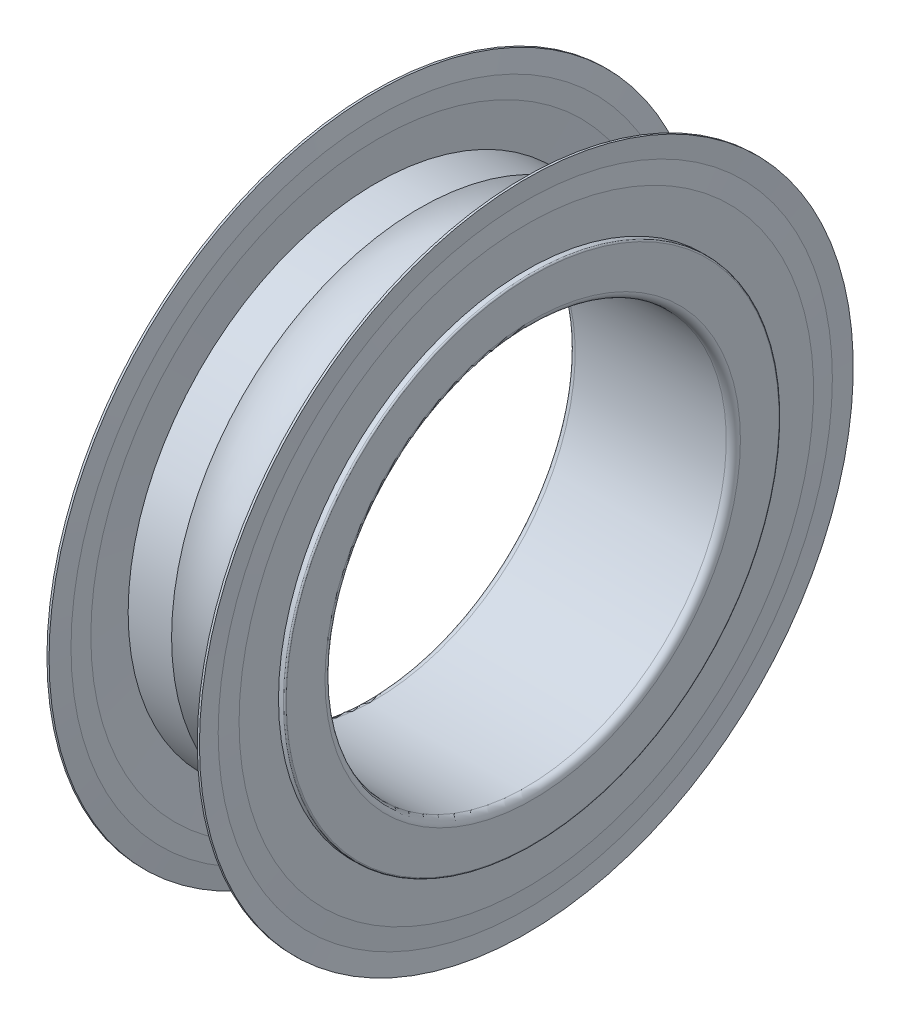
ISO-10303-21;
HEADER;
FILE_DESCRIPTION(('STEP AP214'),'2;1');
FILE_NAME('part.step','',(''),(''),'','','');
FILE_SCHEMA(('AUTOMOTIVE_DESIGN { 1 0 10303 214 1 1 1 1 }'));
ENDSEC;
DATA;
#1=APPLICATION_CONTEXT('core data for automotive mechanical design processes');
#2=APPLICATION_PROTOCOL_DEFINITION('international standard','automotive_design',2000,#1);
#3=PRODUCT_CONTEXT('',#1,'mechanical');
#4=PRODUCT('Part','Part','',(#3));
#5=PRODUCT_RELATED_PRODUCT_CATEGORY('part','',(#4));
#6=PRODUCT_DEFINITION_FORMATION('','',#4);
#7=PRODUCT_DEFINITION_CONTEXT('part definition',#1,'design');
#8=PRODUCT_DEFINITION('design','',#6,#7);
#9=PRODUCT_DEFINITION_SHAPE('','',#8);
#10=(LENGTH_UNIT() NAMED_UNIT(*) SI_UNIT(.MILLI.,.METRE.));
#11=(NAMED_UNIT(*) PLANE_ANGLE_UNIT() SI_UNIT($,.RADIAN.));
#12=(NAMED_UNIT(*) SI_UNIT($,.STERADIAN.) SOLID_ANGLE_UNIT());
#13=UNCERTAINTY_MEASURE_WITH_UNIT(LENGTH_MEASURE(1.E-05),#10,'distance_accuracy_value','');
#14=(GEOMETRIC_REPRESENTATION_CONTEXT(3) GLOBAL_UNCERTAINTY_ASSIGNED_CONTEXT((#13)) GLOBAL_UNIT_ASSIGNED_CONTEXT((#10,
#11,#12)) REPRESENTATION_CONTEXT('',''));
#15=CARTESIAN_POINT('',(0.,0.,0.));
#16=DIRECTION('',(0.,0.,1.));
#17=DIRECTION('',(1.,0.,0.));
#18=AXIS2_PLACEMENT_3D('',#15,#16,#17);
#19=CARTESIAN_POINT('',(0.,-10.725262117958,-10.44));
#20=DIRECTION('',(-1.,0.,0.));
#21=DIRECTION('',(0.,0.,1.));
#22=AXIS2_PLACEMENT_3D('',#19,#20,#21);
#23=PLANE('',#22);
#24=CARTESIAN_POINT('',(0.,0.,0.));
#25=DIRECTION('',(-1.,0.,0.));
#26=DIRECTION('',(0.,0.,-1.));
#27=AXIS2_PLACEMENT_3D('',#24,#25,#26);
#28=CIRCLE('',#27,10.44);
#29=CARTESIAN_POINT('',(0.,0.,-10.44));
#30=VERTEX_POINT('',#29);
#31=EDGE_CURVE('E100',#30,#30,#28,.F.);
#32=ORIENTED_EDGE('',*,*,#31,.F.);
#33=EDGE_LOOP('',(#32));
#34=FACE_BOUND('',#33,.T.);
#35=CARTESIAN_POINT('',(0.,0.,0.));
#36=DIRECTION('',(1.,0.,0.));
#37=DIRECTION('',(0.,0.,1.));
#38=AXIS2_PLACEMENT_3D('',#35,#36,#37);
#39=CIRCLE('',#38,8.8);
#40=CARTESIAN_POINT('',(0.,0.,8.8));
#41=VERTEX_POINT('',#40);
#42=EDGE_CURVE('E97',#41,#41,#39,.T.);
#43=ORIENTED_EDGE('',*,*,#42,.T.);
#44=EDGE_LOOP('',(#43));
#45=FACE_BOUND('',#44,.T.);
#46=ADVANCED_FACE('F17',(#34,#45),#23,.T.);
#47=CARTESIAN_POINT('',(7.,-10.7252621001512,10.44));
#48=DIRECTION('',(1.,0.,0.));
#49=DIRECTION('',(0.,0.,-1.));
#50=AXIS2_PLACEMENT_3D('',#47,#48,#49);
#51=PLANE('',#50);
#52=CARTESIAN_POINT('',(7.,0.,0.));
#53=DIRECTION('',(1.,0.,0.));
#54=DIRECTION('',(0.,-1.16858417365909E-09,1.));
#55=AXIS2_PLACEMENT_3D('',#52,#53,#54);
#56=CIRCLE('',#55,10.44);
#57=CARTESIAN_POINT('',(7.,-1.22000187730009E-08,10.44));
#58=VERTEX_POINT('',#57);
#59=EDGE_CURVE('E94',#58,#58,#56,.T.);
#60=ORIENTED_EDGE('',*,*,#59,.T.);
#61=EDGE_LOOP('',(#60));
#62=FACE_BOUND('',#61,.T.);
#63=CARTESIAN_POINT('',(7.,0.,0.));
#64=DIRECTION('',(-1.,0.,0.));
#65=DIRECTION('',(0.,0.,-1.));
#66=AXIS2_PLACEMENT_3D('',#63,#64,#65);
#67=CIRCLE('',#66,8.80000005879814);
#68=CARTESIAN_POINT('',(7.,0.,-8.80000005879814));
#69=VERTEX_POINT('',#68);
#70=EDGE_CURVE('E91',#69,#69,#67,.F.);
#71=ORIENTED_EDGE('',*,*,#70,.F.);
#72=EDGE_LOOP('',(#71));
#73=FACE_BOUND('',#72,.T.);
#74=ADVANCED_FACE('F109',(#62,#73),#51,.T.);
#75=CARTESIAN_POINT('',(0.27,-12.3960741033497,-12.17));
#76=DIRECTION('',(-1.,0.,0.));
#77=DIRECTION('',(0.,0.,1.));
#78=AXIS2_PLACEMENT_3D('',#75,#76,#77);
#79=PLANE('',#78);
#80=CARTESIAN_POINT('',(0.27,0.,0.));
#81=DIRECTION('',(-1.,0.,0.));
#82=DIRECTION('',(0.,0.,-1.));
#83=AXIS2_PLACEMENT_3D('',#80,#81,#82);
#84=CIRCLE('',#83,12.1700000000001);
#85=CARTESIAN_POINT('',(0.27,0.,-12.1700000000001));
#86=VERTEX_POINT('',#85);
#87=EDGE_CURVE('E88',#86,#86,#84,.F.);
#88=ORIENTED_EDGE('',*,*,#87,.F.);
#89=EDGE_LOOP('',(#88));
#90=FACE_BOUND('',#89,.T.);
#91=CARTESIAN_POINT('',(0.27,0.,0.));
#92=DIRECTION('',(1.,0.,0.));
#93=DIRECTION('',(0.,-1.16847822423118E-09,1.));
#94=AXIS2_PLACEMENT_3D('',#91,#92,#93);
#95=CIRCLE('',#94,10.5);
#96=CARTESIAN_POINT('',(0.27,-1.22690213544274E-08,10.5));
#97=VERTEX_POINT('',#96);
#98=EDGE_CURVE('E85',#97,#97,#95,.T.);
#99=ORIENTED_EDGE('',*,*,#98,.T.);
#100=EDGE_LOOP('',(#99));
#101=FACE_BOUND('',#100,.T.);
#102=ADVANCED_FACE('F343',(#90,#101),#79,.T.);
#103=CARTESIAN_POINT('',(0.45,-13.2516782320936,13.01));
#104=DIRECTION('',(1.,0.,0.));
#105=DIRECTION('',(0.,0.,-1.));
#106=AXIS2_PLACEMENT_3D('',#103,#104,#105);
#107=PLANE('',#106);
#108=CARTESIAN_POINT('',(0.45,0.,0.));
#109=DIRECTION('',(1.,0.,0.));
#110=DIRECTION('',(0.,0.,1.));
#111=AXIS2_PLACEMENT_3D('',#108,#109,#110);
#112=CIRCLE('',#111,13.01);
#113=CARTESIAN_POINT('',(0.45,0.,13.01));
#114=VERTEX_POINT('',#113);
#115=EDGE_CURVE('E82',#114,#114,#112,.T.);
#116=ORIENTED_EDGE('',*,*,#115,.T.);
#117=EDGE_LOOP('',(#116));
#118=FACE_BOUND('',#117,.T.);
#119=CARTESIAN_POINT('',(0.45,0.,0.));
#120=DIRECTION('',(-1.,0.,0.));
#121=DIRECTION('',(0.,0.,-1.));
#122=AXIS2_PLACEMENT_3D('',#119,#120,#121);
#123=CIRCLE('',#122,12.17);
#124=CARTESIAN_POINT('',(0.45,0.,-12.17));
#125=VERTEX_POINT('',#124);
#126=EDGE_CURVE('E79',#125,#125,#123,.F.);
#127=ORIENTED_EDGE('',*,*,#126,.F.);
#128=EDGE_LOOP('',(#127));
#129=FACE_BOUND('',#128,.T.);
#130=ADVANCED_FACE('F333',(#118,#129),#107,.T.);
#131=CARTESIAN_POINT('',(6.55,-13.2516782320936,-13.01));
#132=DIRECTION('',(-1.,0.,0.));
#133=DIRECTION('',(0.,0.,1.));
#134=AXIS2_PLACEMENT_3D('',#131,#132,#133);
#135=PLANE('',#134);
#136=CARTESIAN_POINT('',(6.55,0.,0.));
#137=DIRECTION('',(-1.,0.,0.));
#138=DIRECTION('',(0.,0.,-1.));
#139=AXIS2_PLACEMENT_3D('',#136,#137,#138);
#140=CIRCLE('',#139,13.01);
#141=CARTESIAN_POINT('',(6.55,0.,-13.01));
#142=VERTEX_POINT('',#141);
#143=EDGE_CURVE('E76',#142,#142,#140,.F.);
#144=ORIENTED_EDGE('',*,*,#143,.F.);
#145=EDGE_LOOP('',(#144));
#146=FACE_BOUND('',#145,.T.);
#147=CARTESIAN_POINT('',(6.55,0.,0.));
#148=DIRECTION('',(1.,0.,0.));
#149=DIRECTION('',(0.,0.,1.));
#150=AXIS2_PLACEMENT_3D('',#147,#148,#149);
#151=CIRCLE('',#150,12.17);
#152=CARTESIAN_POINT('',(6.55,0.,12.17));
#153=VERTEX_POINT('',#152);
#154=EDGE_CURVE('E73',#153,#153,#151,.T.);
#155=ORIENTED_EDGE('',*,*,#154,.T.);
#156=EDGE_LOOP('',(#155));
#157=FACE_BOUND('',#156,.T.);
#158=ADVANCED_FACE('F323',(#146,#157),#135,.T.);
#159=CARTESIAN_POINT('',(6.73,-12.3960741033497,12.17));
#160=DIRECTION('',(1.,0.,0.));
#161=DIRECTION('',(0.,0.,-1.));
#162=AXIS2_PLACEMENT_3D('',#159,#160,#161);
#163=PLANE('',#162);
#164=CARTESIAN_POINT('',(6.73,0.,0.));
#165=DIRECTION('',(1.,0.,0.));
#166=DIRECTION('',(0.,0.,1.));
#167=AXIS2_PLACEMENT_3D('',#164,#165,#166);
#168=CIRCLE('',#167,12.17);
#169=CARTESIAN_POINT('',(6.73,0.,12.17));
#170=VERTEX_POINT('',#169);
#171=EDGE_CURVE('E70',#170,#170,#168,.T.);
#172=ORIENTED_EDGE('',*,*,#171,.T.);
#173=EDGE_LOOP('',(#172));
#174=FACE_BOUND('',#173,.T.);
#175=CARTESIAN_POINT('',(6.73,0.,0.));
#176=DIRECTION('',(-1.,0.,0.));
#177=DIRECTION('',(0.,0.,-1.));
#178=AXIS2_PLACEMENT_3D('',#175,#176,#177);
#179=CIRCLE('',#178,10.5);
#180=CARTESIAN_POINT('',(6.73,0.,-10.5));
#181=VERTEX_POINT('',#180);
#182=EDGE_CURVE('E67',#181,#181,#179,.T.);
#183=ORIENTED_EDGE('',*,*,#182,.T.);
#184=EDGE_LOOP('',(#183));
#185=FACE_BOUND('',#184,.T.);
#186=ADVANCED_FACE('F313',(#174,#185),#163,.T.);
#187=CARTESIAN_POINT('',(50.,0.,0.));
#188=DIRECTION('',(1.,0.,0.));
#189=DIRECTION('',(0.,1.92345373302569E-10,1.));
#190=AXIS2_PLACEMENT_3D('',#187,#188,#189);
#191=CYLINDRICAL_SURFACE('',#190,10.5);
#192=CARTESIAN_POINT('',(4.7993229967949,0.,0.));
#193=DIRECTION('',(1.,0.,0.));
#194=DIRECTION('',(0.,0.,1.));
#195=AXIS2_PLACEMENT_3D('',#192,#193,#194);
#196=CIRCLE('',#195,10.5);
#197=CARTESIAN_POINT('',(4.7993229967949,0.,10.5));
#198=VERTEX_POINT('',#197);
#199=EDGE_CURVE('E64',#198,#198,#196,.T.);
#200=ORIENTED_EDGE('',*,*,#199,.T.);
#201=EDGE_LOOP('',(#200));
#202=FACE_BOUND('',#201,.T.);
#203=CARTESIAN_POINT('',(6.63946428571429,0.,0.));
#204=DIRECTION('',(-1.,0.,0.));
#205=DIRECTION('',(0.,0.,-1.));
#206=AXIS2_PLACEMENT_3D('',#203,#204,#205);
#207=CIRCLE('',#206,10.5);
#208=CARTESIAN_POINT('',(6.63946428571429,0.,-10.5));
#209=VERTEX_POINT('',#208);
#210=EDGE_CURVE('E61',#209,#209,#207,.F.);
#211=ORIENTED_EDGE('',*,*,#210,.F.);
#212=EDGE_LOOP('',(#211));
#213=FACE_BOUND('',#212,.T.);
#214=ADVANCED_FACE('F304',(#202,#213),#191,.T.);
#215=CARTESIAN_POINT('',(50.,0.,0.));
#216=DIRECTION('',(1.,0.,0.));
#217=DIRECTION('',(0.,0.,1.));
#218=AXIS2_PLACEMENT_3D('',#215,#216,#217);
#219=CYLINDRICAL_SURFACE('',#218,10.5);
#220=CARTESIAN_POINT('',(0.0599999999999952,0.,0.));
#221=DIRECTION('',(1.,0.,0.));
#222=DIRECTION('',(0.,0.,1.));
#223=AXIS2_PLACEMENT_3D('',#220,#221,#222);
#224=CIRCLE('',#223,10.5);
#225=CARTESIAN_POINT('',(0.0599999999999952,0.,10.5));
#226=VERTEX_POINT('',#225);
#227=EDGE_CURVE('E58',#226,#226,#224,.T.);
#228=ORIENTED_EDGE('',*,*,#227,.T.);
#229=EDGE_LOOP('',(#228));
#230=FACE_BOUND('',#229,.T.);
#231=ORIENTED_EDGE('',*,*,#98,.F.);
#232=EDGE_LOOP('',(#231));
#233=FACE_BOUND('',#232,.T.);
#234=ADVANCED_FACE('F126',(#230,#233),#219,.T.);
#235=CARTESIAN_POINT('',(0.0600000000003298,0.,0.));
#236=DIRECTION('',(1.,0.,0.));
#237=DIRECTION('',(0.,0.,1.));
#238=AXIS2_PLACEMENT_3D('',#235,#236,#237);
#239=TOROIDAL_SURFACE('',#238,10.4399999999997,0.0600000000003289);
#240=ORIENTED_EDGE('',*,*,#31,.T.);
#241=EDGE_LOOP('',(#240));
#242=FACE_BOUND('',#241,.T.);
#243=ORIENTED_EDGE('',*,*,#227,.F.);
#244=EDGE_LOOP('',(#243));
#245=FACE_BOUND('',#244,.T.);
#246=ADVANCED_FACE('F104',(#242,#245),#239,.T.);
#247=CARTESIAN_POINT('',(0.299999999999936,0.,0.));
#248=DIRECTION('',(1.,0.,0.));
#249=DIRECTION('',(0.,0.,1.));
#250=AXIS2_PLACEMENT_3D('',#247,#248,#249);
#251=TOROIDAL_SURFACE('',#250,8.8,0.299999999999936);
#252=CARTESIAN_POINT('',(0.3,0.,0.));
#253=DIRECTION('',(1.,0.,0.));
#254=DIRECTION('',(0.,0.,1.));
#255=AXIS2_PLACEMENT_3D('',#252,#253,#254);
#256=CIRCLE('',#255,8.50000000000006);
#257=CARTESIAN_POINT('',(0.3,0.,8.50000000000006));
#258=VERTEX_POINT('',#257);
#259=EDGE_CURVE('E55',#258,#258,#256,.T.);
#260=ORIENTED_EDGE('',*,*,#259,.T.);
#261=EDGE_LOOP('',(#260));
#262=FACE_BOUND('',#261,.T.);
#263=ORIENTED_EDGE('',*,*,#42,.F.);
#264=EDGE_LOOP('',(#263));
#265=FACE_BOUND('',#264,.T.);
#266=ADVANCED_FACE('F113',(#262,#265),#251,.T.);
#267=CARTESIAN_POINT('',(50.,0.,0.));
#268=DIRECTION('',(1.,0.,0.));
#269=DIRECTION('',(0.,0.,1.));
#270=AXIS2_PLACEMENT_3D('',#267,#268,#269);
#271=CYLINDRICAL_SURFACE('',#270,8.5);
#272=CARTESIAN_POINT('',(6.7,0.,0.));
#273=DIRECTION('',(1.,0.,0.));
#274=DIRECTION('',(0.,0.,1.));
#275=AXIS2_PLACEMENT_3D('',#272,#273,#274);
#276=CIRCLE('',#275,8.5);
#277=CARTESIAN_POINT('',(6.7,0.,8.5));
#278=VERTEX_POINT('',#277);
#279=EDGE_CURVE('E52',#278,#278,#276,.T.);
#280=ORIENTED_EDGE('',*,*,#279,.T.);
#281=EDGE_LOOP('',(#280));
#282=FACE_BOUND('',#281,.T.);
#283=ORIENTED_EDGE('',*,*,#259,.F.);
#284=EDGE_LOOP('',(#283));
#285=FACE_BOUND('',#284,.T.);
#286=ADVANCED_FACE('F115',(#282,#285),#271,.F.);
#287=CARTESIAN_POINT('',(6.70000000000013,0.,0.));
#288=DIRECTION('',(1.,0.,0.));
#289=DIRECTION('',(0.,0.,1.));
#290=AXIS2_PLACEMENT_3D('',#287,#288,#289);
#291=TOROIDAL_SURFACE('',#290,8.79999999999988,0.299999999999875);
#292=ORIENTED_EDGE('',*,*,#70,.T.);
#293=EDGE_LOOP('',(#292));
#294=FACE_BOUND('',#293,.T.);
#295=ORIENTED_EDGE('',*,*,#279,.F.);
#296=EDGE_LOOP('',(#295));
#297=FACE_BOUND('',#296,.T.);
#298=ADVANCED_FACE('F123',(#294,#297),#291,.T.);
#299=CARTESIAN_POINT('',(6.93999999999968,0.,0.));
#300=DIRECTION('',(1.,0.,0.));
#301=DIRECTION('',(0.,0.,1.));
#302=AXIS2_PLACEMENT_3D('',#299,#300,#301);
#303=TOROIDAL_SURFACE('',#302,10.4399999999997,0.0600000000003194);
#304=CARTESIAN_POINT('',(6.93999999999968,0.,0.));
#305=DIRECTION('',(1.,0.,0.));
#306=DIRECTION('',(0.,0.,1.));
#307=AXIS2_PLACEMENT_3D('',#304,#305,#306);
#308=CIRCLE('',#307,10.5);
#309=CARTESIAN_POINT('',(6.93999999999968,0.,10.5));
#310=VERTEX_POINT('',#309);
#311=EDGE_CURVE('E49',#310,#310,#308,.T.);
#312=ORIENTED_EDGE('',*,*,#311,.T.);
#313=EDGE_LOOP('',(#312));
#314=FACE_BOUND('',#313,.T.);
#315=ORIENTED_EDGE('',*,*,#59,.F.);
#316=EDGE_LOOP('',(#315));
#317=FACE_BOUND('',#316,.T.);
#318=ADVANCED_FACE('F132',(#314,#317),#303,.T.);
#319=CARTESIAN_POINT('',(50.,0.,0.));
#320=DIRECTION('',(1.,0.,0.));
#321=DIRECTION('',(0.,0.,1.));
#322=AXIS2_PLACEMENT_3D('',#319,#320,#321);
#323=CYLINDRICAL_SURFACE('',#322,10.5);
#324=ORIENTED_EDGE('',*,*,#182,.F.);
#325=EDGE_LOOP('',(#324));
#326=FACE_BOUND('',#325,.T.);
#327=ORIENTED_EDGE('',*,*,#311,.F.);
#328=EDGE_LOOP('',(#327));
#329=FACE_BOUND('',#328,.T.);
#330=ADVANCED_FACE('F136',(#326,#329),#323,.T.);
#331=CARTESIAN_POINT('',(3.5,0.,0.));
#332=DIRECTION('',(1.,0.,0.));
#333=DIRECTION('',(0.,0.,1.));
#334=AXIS2_PLACEMENT_3D('',#331,#332,#333);
#335=TOROIDAL_SURFACE('',#334,12.,1.98450000000008);
#336=ORIENTED_EDGE('',*,*,#199,.F.);
#337=EDGE_LOOP('',(#336));
#338=FACE_BOUND('',#337,.T.);
#339=CARTESIAN_POINT('',(2.20067700320506,0.,0.));
#340=DIRECTION('',(1.,0.,0.));
#341=DIRECTION('',(0.,0.,1.));
#342=AXIS2_PLACEMENT_3D('',#339,#340,#341);
#343=CIRCLE('',#342,10.5);
#344=CARTESIAN_POINT('',(2.20067700320506,0.,10.5));
#345=VERTEX_POINT('',#344);
#346=EDGE_CURVE('E46',#345,#345,#343,.T.);
#347=ORIENTED_EDGE('',*,*,#346,.T.);
#348=EDGE_LOOP('',(#347));
#349=FACE_BOUND('',#348,.T.);
#350=ADVANCED_FACE('F140',(#338,#349),#335,.F.);
#351=CARTESIAN_POINT('',(50.,0.,0.));
#352=DIRECTION('',(1.,0.,0.));
#353=DIRECTION('',(0.,0.,1.));
#354=AXIS2_PLACEMENT_3D('',#351,#352,#353);
#355=CYLINDRICAL_SURFACE('',#354,10.5);
#356=CARTESIAN_POINT('',(0.36053571428571,0.,0.));
#357=DIRECTION('',(1.,0.,0.));
#358=DIRECTION('',(0.,0.,1.));
#359=AXIS2_PLACEMENT_3D('',#356,#357,#358);
#360=CIRCLE('',#359,10.5);
#361=CARTESIAN_POINT('',(0.36053571428571,0.,10.5));
#362=VERTEX_POINT('',#361);
#363=EDGE_CURVE('E43',#362,#362,#360,.F.);
#364=ORIENTED_EDGE('',*,*,#363,.F.);
#365=EDGE_LOOP('',(#364));
#366=FACE_BOUND('',#365,.T.);
#367=ORIENTED_EDGE('',*,*,#346,.F.);
#368=EDGE_LOOP('',(#367));
#369=FACE_BOUND('',#368,.T.);
#370=ADVANCED_FACE('F144',(#366,#369),#355,.T.);
#371=CARTESIAN_POINT('',(50.,0.,0.));
#372=DIRECTION('',(1.,0.,0.));
#373=DIRECTION('',(0.,1.92321836574447E-10,1.));
#374=AXIS2_PLACEMENT_3D('',#371,#372,#373);
#375=CYLINDRICAL_SURFACE('',#374,13.85);
#376=CARTESIAN_POINT('',(0.270000000000003,0.,0.));
#377=DIRECTION('',(1.,0.,0.));
#378=DIRECTION('',(0.,0.,1.));
#379=AXIS2_PLACEMENT_3D('',#376,#377,#378);
#380=CIRCLE('',#379,13.85);
#381=CARTESIAN_POINT('',(0.270000000000003,0.,13.85));
#382=VERTEX_POINT('',#381);
#383=EDGE_CURVE('E40',#382,#382,#380,.T.);
#384=ORIENTED_EDGE('',*,*,#383,.T.);
#385=EDGE_LOOP('',(#384));
#386=FACE_BOUND('',#385,.T.);
#387=CARTESIAN_POINT('',(0.359999999999999,0.,0.));
#388=DIRECTION('',(-1.,0.,0.));
#389=DIRECTION('',(0.,0.,-1.));
#390=AXIS2_PLACEMENT_3D('',#387,#388,#389);
#391=CIRCLE('',#390,13.85);
#392=CARTESIAN_POINT('',(0.359999999999999,0.,-13.85));
#393=VERTEX_POINT('',#392);
#394=EDGE_CURVE('E37',#393,#393,#391,.F.);
#395=ORIENTED_EDGE('',*,*,#394,.F.);
#396=EDGE_LOOP('',(#395));
#397=FACE_BOUND('',#396,.T.);
#398=ADVANCED_FACE('F148',(#386,#397),#375,.T.);
#399=CARTESIAN_POINT('',(0.27,0.,0.));
#400=DIRECTION('',(-1.,0.,0.));
#401=DIRECTION('',(0.,0.,-1.));
#402=AXIS2_PLACEMENT_3D('',#399,#400,#401);
#403=CONICAL_SURFACE('',#402,13.85,1.51727605833558);
#404=ORIENTED_EDGE('',*,*,#383,.F.);
#405=EDGE_LOOP('',(#404));
#406=FACE_BOUND('',#405,.T.);
#407=CARTESIAN_POINT('',(0.315000000000003,0.,0.));
#408=DIRECTION('',(1.,0.,0.));
#409=DIRECTION('',(0.,0.,1.));
#410=AXIS2_PLACEMENT_3D('',#407,#408,#409);
#411=CIRCLE('',#410,13.01);
#412=CARTESIAN_POINT('',(0.315000000000003,0.,13.01));
#413=VERTEX_POINT('',#412);
#414=EDGE_CURVE('E32',#413,#413,#411,.T.);
#415=ORIENTED_EDGE('',*,*,#414,.T.);
#416=EDGE_LOOP('',(#415));
#417=FACE_BOUND('',#416,.T.);
#418=ADVANCED_FACE('F152',(#406,#417),#403,.F.);
#419=CARTESIAN_POINT('',(0.315,0.,0.));
#420=DIRECTION('',(1.,0.,0.));
#421=DIRECTION('',(0.,0.,1.));
#422=AXIS2_PLACEMENT_3D('',#419,#420,#421);
#423=CONICAL_SURFACE('',#422,13.01,1.51727605833558);
#424=ORIENTED_EDGE('',*,*,#87,.T.);
#425=EDGE_LOOP('',(#424));
#426=FACE_BOUND('',#425,.T.);
#427=ORIENTED_EDGE('',*,*,#414,.F.);
#428=EDGE_LOOP('',(#427));
#429=FACE_BOUND('',#428,.T.);
#430=ADVANCED_FACE('F156',(#426,#429),#423,.T.);
#431=CARTESIAN_POINT('',(0.45,0.,0.));
#432=DIRECTION('',(1.,0.,0.));
#433=DIRECTION('',(0.,0.,1.));
#434=AXIS2_PLACEMENT_3D('',#431,#432,#433);
#435=CONICAL_SURFACE('',#434,12.17,1.51727605833558);
#436=ORIENTED_EDGE('',*,*,#126,.T.);
#437=EDGE_LOOP('',(#436));
#438=FACE_BOUND('',#437,.T.);
#439=ORIENTED_EDGE('',*,*,#363,.T.);
#440=EDGE_LOOP('',(#439));
#441=FACE_BOUND('',#440,.T.);
#442=ADVANCED_FACE('F160',(#438,#441),#435,.F.);
#443=CARTESIAN_POINT('',(0.359999999999999,0.,0.));
#444=DIRECTION('',(-1.,0.,0.));
#445=DIRECTION('',(0.,0.,-1.));
#446=AXIS2_PLACEMENT_3D('',#443,#444,#445);
#447=CONICAL_SURFACE('',#446,13.85,1.46406065414576);
#448=ORIENTED_EDGE('',*,*,#394,.T.);
#449=EDGE_LOOP('',(#448));
#450=FACE_BOUND('',#449,.T.);
#451=ORIENTED_EDGE('',*,*,#115,.F.);
#452=EDGE_LOOP('',(#451));
#453=FACE_BOUND('',#452,.T.);
#454=ADVANCED_FACE('F164',(#450,#453),#447,.T.);
#455=CARTESIAN_POINT('',(6.64,0.,0.));
#456=DIRECTION('',(1.,0.,0.));
#457=DIRECTION('',(0.,1.92333382893903E-10,1.));
#458=AXIS2_PLACEMENT_3D('',#455,#456,#457);
#459=CONICAL_SURFACE('',#458,13.85,1.46406065414576);
#460=ORIENTED_EDGE('',*,*,#143,.T.);
#461=EDGE_LOOP('',(#460));
#462=FACE_BOUND('',#461,.T.);
#463=CARTESIAN_POINT('',(6.64,0.,0.));
#464=DIRECTION('',(-1.,0.,0.));
#465=DIRECTION('',(0.,0.,-1.));
#466=AXIS2_PLACEMENT_3D('',#463,#464,#465);
#467=CIRCLE('',#466,13.85);
#468=CARTESIAN_POINT('',(6.64,0.,-13.85));
#469=VERTEX_POINT('',#468);
#470=EDGE_CURVE('E28',#469,#469,#467,.F.);
#471=ORIENTED_EDGE('',*,*,#470,.F.);
#472=EDGE_LOOP('',(#471));
#473=FACE_BOUND('',#472,.T.);
#474=ADVANCED_FACE('F168',(#462,#473),#459,.T.);
#475=CARTESIAN_POINT('',(6.55,0.,0.));
#476=DIRECTION('',(-1.,0.,0.));
#477=DIRECTION('',(0.,0.,-1.));
#478=AXIS2_PLACEMENT_3D('',#475,#476,#477);
#479=CONICAL_SURFACE('',#478,12.17,1.51727605833558);
#480=ORIENTED_EDGE('',*,*,#210,.T.);
#481=EDGE_LOOP('',(#480));
#482=FACE_BOUND('',#481,.T.);
#483=ORIENTED_EDGE('',*,*,#154,.F.);
#484=EDGE_LOOP('',(#483));
#485=FACE_BOUND('',#484,.T.);
#486=ADVANCED_FACE('F172',(#482,#485),#479,.F.);
#487=CARTESIAN_POINT('',(6.685,0.,0.));
#488=DIRECTION('',(-1.,0.,0.));
#489=DIRECTION('',(0.,0.,-1.));
#490=AXIS2_PLACEMENT_3D('',#487,#488,#489);
#491=CONICAL_SURFACE('',#490,13.01,1.51727605833558);
#492=ORIENTED_EDGE('',*,*,#171,.F.);
#493=EDGE_LOOP('',(#492));
#494=FACE_BOUND('',#493,.T.);
#495=CARTESIAN_POINT('',(6.685,0.,0.));
#496=DIRECTION('',(1.,0.,0.));
#497=DIRECTION('',(0.,0.,1.));
#498=AXIS2_PLACEMENT_3D('',#495,#496,#497);
#499=CIRCLE('',#498,13.01);
#500=CARTESIAN_POINT('',(6.685,0.,13.01));
#501=VERTEX_POINT('',#500);
#502=EDGE_CURVE('E24',#501,#501,#499,.T.);
#503=ORIENTED_EDGE('',*,*,#502,.T.);
#504=EDGE_LOOP('',(#503));
#505=FACE_BOUND('',#504,.T.);
#506=ADVANCED_FACE('F176',(#494,#505),#491,.T.);
#507=CARTESIAN_POINT('',(6.73,0.,0.));
#508=DIRECTION('',(1.,0.,0.));
#509=DIRECTION('',(0.,0.,1.));
#510=AXIS2_PLACEMENT_3D('',#507,#508,#509);
#511=CONICAL_SURFACE('',#510,13.85,1.51727605833558);
#512=CARTESIAN_POINT('',(6.73,0.,0.));
#513=DIRECTION('',(1.,0.,0.));
#514=DIRECTION('',(0.,0.,1.));
#515=AXIS2_PLACEMENT_3D('',#512,#513,#514);
#516=CIRCLE('',#515,13.85);
#517=CARTESIAN_POINT('',(6.73,0.,13.85));
#518=VERTEX_POINT('',#517);
#519=EDGE_CURVE('E10',#518,#518,#516,.T.);
#520=ORIENTED_EDGE('',*,*,#519,.T.);
#521=EDGE_LOOP('',(#520));
#522=FACE_BOUND('',#521,.T.);
#523=ORIENTED_EDGE('',*,*,#502,.F.);
#524=EDGE_LOOP('',(#523));
#525=FACE_BOUND('',#524,.T.);
#526=ADVANCED_FACE('F179',(#522,#525),#511,.F.);
#527=CARTESIAN_POINT('',(50.,0.,0.));
#528=DIRECTION('',(1.,0.,0.));
#529=DIRECTION('',(0.,1.92333382893903E-10,1.));
#530=AXIS2_PLACEMENT_3D('',#527,#528,#529);
#531=CYLINDRICAL_SURFACE('',#530,13.85);
#532=ORIENTED_EDGE('',*,*,#470,.T.);
#533=EDGE_LOOP('',(#532));
#534=FACE_BOUND('',#533,.T.);
#535=ORIENTED_EDGE('',*,*,#519,.F.);
#536=EDGE_LOOP('',(#535));
#537=FACE_BOUND('',#536,.T.);
#538=ADVANCED_FACE('F19',(#534,#537),#531,.T.);
#539=CLOSED_SHELL('',(#46,#74,#102,#130,#158,#186,#214,#234,#246,#266,#286,#298,#318,#330,#350,
#370,#398,#418,#430,#442,#454,#474,#486,#506,#526,#538));
#540=MANIFOLD_SOLID_BREP('B1',#539);
#541=ADVANCED_BREP_SHAPE_REPRESENTATION('',(#18,#540),#14);
#542=SHAPE_DEFINITION_REPRESENTATION(#9,#541);
ENDSEC;
END-ISO-10303-21;
